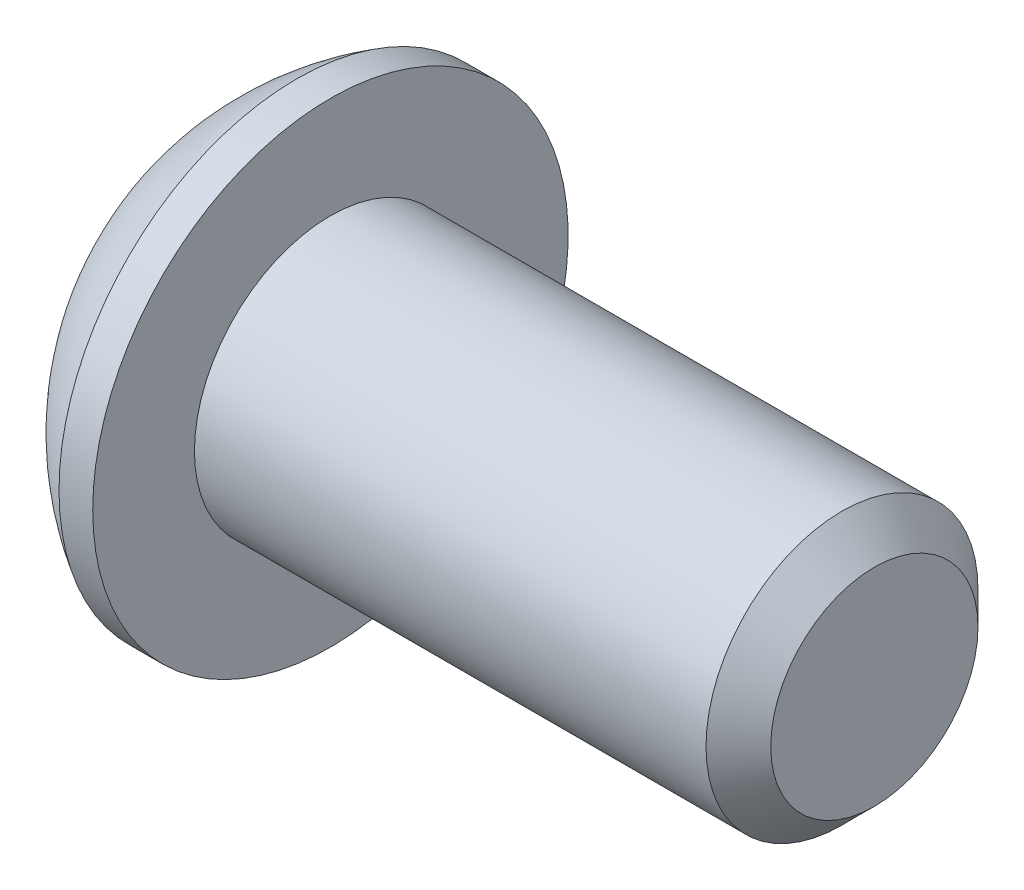
ISO-10303-21;
HEADER;
FILE_DESCRIPTION(('STEP AP214'),'2;1');
FILE_NAME('part.step','',(''),(''),'','','');
FILE_SCHEMA(('AUTOMOTIVE_DESIGN { 1 0 10303 214 1 1 1 1 }'));
ENDSEC;
DATA;
#1=APPLICATION_CONTEXT('core data for automotive mechanical design processes');
#2=APPLICATION_PROTOCOL_DEFINITION('international standard','automotive_design',2000,#1);
#3=PRODUCT_CONTEXT('',#1,'mechanical');
#4=PRODUCT('Part','Part','',(#3));
#5=PRODUCT_RELATED_PRODUCT_CATEGORY('part','',(#4));
#6=PRODUCT_DEFINITION_FORMATION('','',#4);
#7=PRODUCT_DEFINITION_CONTEXT('part definition',#1,'design');
#8=PRODUCT_DEFINITION('design','',#6,#7);
#9=PRODUCT_DEFINITION_SHAPE('','',#8);
#10=(LENGTH_UNIT() NAMED_UNIT(*) SI_UNIT(.MILLI.,.METRE.));
#11=(NAMED_UNIT(*) PLANE_ANGLE_UNIT() SI_UNIT($,.RADIAN.));
#12=(NAMED_UNIT(*) SI_UNIT($,.STERADIAN.) SOLID_ANGLE_UNIT());
#13=UNCERTAINTY_MEASURE_WITH_UNIT(LENGTH_MEASURE(1.E-05),#10,'distance_accuracy_value','');
#14=(GEOMETRIC_REPRESENTATION_CONTEXT(3) GLOBAL_UNCERTAINTY_ASSIGNED_CONTEXT((#13)) GLOBAL_UNIT_ASSIGNED_CONTEXT((#10,
#11,#12)) REPRESENTATION_CONTEXT('',''));
#15=CARTESIAN_POINT('',(0.,0.,0.));
#16=DIRECTION('',(0.,0.,1.));
#17=DIRECTION('',(1.,0.,0.));
#18=AXIS2_PLACEMENT_3D('',#15,#16,#17);
#19=CARTESIAN_POINT('',(0.,0.,0.));
#20=DIRECTION('',(-1.,0.,0.));
#21=DIRECTION('',(0.,0.,1.));
#22=AXIS2_PLACEMENT_3D('',#19,#20,#21);
#23=PLANE('',#22);
#24=CARTESIAN_POINT('',(0.,0.,0.));
#25=DIRECTION('',(-1.,0.,0.));
#26=DIRECTION('',(0.,0.,1.));
#27=AXIS2_PLACEMENT_3D('',#24,#25,#26);
#28=CIRCLE('',#27,2.77495);
#29=CARTESIAN_POINT('',(0.,2.77495,0.));
#30=VERTEX_POINT('',#29);
#31=EDGE_CURVE('E11',#30,#30,#28,.T.);
#32=ORIENTED_EDGE('',*,*,#31,.T.);
#33=EDGE_LOOP('',(#32));
#34=FACE_BOUND('',#33,.T.);
#35=DIRECTION('',(0.,-1.,0.));
#36=VECTOR('',#35,1.);
#37=CARTESIAN_POINT('',(0.,-1.14384635331848,1.9812));
#38=LINE('',#37,#36);
#39=CARTESIAN_POINT('',(0.,1.14384635331849,1.9812));
#40=VERTEX_POINT('',#39);
#41=CARTESIAN_POINT('',(0.,-1.14384635331848,1.9812));
#42=VERTEX_POINT('',#41);
#43=EDGE_CURVE('E50',#40,#42,#38,.T.);
#44=ORIENTED_EDGE('',*,*,#43,.T.);
#45=DIRECTION('',(0.,-0.5,-0.866025403784439));
#46=VECTOR('',#45,1.);
#47=CARTESIAN_POINT('',(0.,-2.28769270663697,0.));
#48=LINE('',#47,#46);
#49=CARTESIAN_POINT('',(0.,-2.28769270663697,0.));
#50=VERTEX_POINT('',#49);
#51=EDGE_CURVE('E374',#42,#50,#48,.T.);
#52=ORIENTED_EDGE('',*,*,#51,.T.);
#53=DIRECTION('',(0.,0.5,-0.866025403784439));
#54=VECTOR('',#53,1.);
#55=CARTESIAN_POINT('',(0.,-1.14384635331848,-1.9812));
#56=LINE('',#55,#54);
#57=CARTESIAN_POINT('',(0.,-1.14384635331848,-1.9812));
#58=VERTEX_POINT('',#57);
#59=EDGE_CURVE('E135',#50,#58,#56,.T.);
#60=ORIENTED_EDGE('',*,*,#59,.T.);
#61=DIRECTION('',(0.,1.,0.));
#62=VECTOR('',#61,1.);
#63=CARTESIAN_POINT('',(0.,1.14384635331849,-1.9812));
#64=LINE('',#63,#62);
#65=CARTESIAN_POINT('',(0.,1.14384635331849,-1.9812));
#66=VERTEX_POINT('',#65);
#67=EDGE_CURVE('E377',#58,#66,#64,.T.);
#68=ORIENTED_EDGE('',*,*,#67,.T.);
#69=DIRECTION('',(0.,0.5,0.866025403784439));
#70=VECTOR('',#69,1.);
#71=CARTESIAN_POINT('',(0.,2.28769270663697,0.));
#72=LINE('',#71,#70);
#73=CARTESIAN_POINT('',(0.,2.28769270663697,0.));
#74=VERTEX_POINT('',#73);
#75=EDGE_CURVE('E379',#66,#74,#72,.T.);
#76=ORIENTED_EDGE('',*,*,#75,.T.);
#77=DIRECTION('',(0.,-0.5,0.866025403784439));
#78=VECTOR('',#77,1.);
#79=CARTESIAN_POINT('',(0.,1.14384635331849,1.9812));
#80=LINE('',#79,#78);
#81=EDGE_CURVE('E381',#74,#40,#80,.T.);
#82=ORIENTED_EDGE('',*,*,#81,.T.);
#83=EDGE_LOOP('',(#44,#52,#60,#68,#76,#82));
#84=FACE_BOUND('',#83,.T.);
#85=ADVANCED_FACE('F36',(#34,#84),#23,.T.);
#86=CARTESIAN_POINT('',(5.78512506188119,0.,0.));
#87=DIRECTION('',(-1.,0.,0.));
#88=DIRECTION('',(0.,1.,0.));
#89=AXIS2_PLACEMENT_3D('',#86,#87,#88);
#90=SPHERICAL_SURFACE('',#89,6.41623094067739);
#91=CARTESIAN_POINT('',(2.5654,0.,0.));
#92=DIRECTION('',(-1.,0.,0.));
#93=DIRECTION('',(0.,0.,1.));
#94=AXIS2_PLACEMENT_3D('',#91,#92,#93);
#95=CIRCLE('',#94,5.5499);
#96=CARTESIAN_POINT('',(2.5654,5.5499,0.));
#97=VERTEX_POINT('',#96);
#98=EDGE_CURVE('E43',#97,#97,#95,.T.);
#99=CARTESIAN_POINT('',(2.5654,5.5499,0.));
#100=CARTESIAN_POINT('',(2.53083708566419,5.52984868712258,0.));
#101=CARTESIAN_POINT('',(2.49646152825914,5.50947442663449,0.));
#102=CARTESIAN_POINT('',(2.42809701945272,5.4680872977392,0.));
#103=CARTESIAN_POINT('',(2.39410806805135,5.44707442933201,0.));
#104=CARTESIAN_POINT('',(2.32652866339446,5.40441737190071,0.));
#105=CARTESIAN_POINT('',(2.29293821013895,5.38277318287661,0.));
#106=CARTESIAN_POINT('',(2.22616751866502,5.33886105159856,0.));
#107=CARTESIAN_POINT('',(2.19298728044662,5.3165931093446,0.));
#108=CARTESIAN_POINT('',(2.12704860244366,5.27144124070729,0.));
#109=CARTESIAN_POINT('',(2.09429016265911,5.24855731432393,0.));
#110=CARTESIAN_POINT('',(2.02920651509859,5.20218146582175,0.));
#111=CARTESIAN_POINT('',(1.99688130732261,5.17868954370292,0.));
#112=CARTESIAN_POINT('',(1.93267540683267,5.13110590319174,0.));
#113=CARTESIAN_POINT('',(1.90079471411871,5.10701418479938,0.));
#114=CARTESIAN_POINT('',(1.83748897146475,5.05823936086599,0.));
#115=CARTESIAN_POINT('',(1.80606392152475,5.03355625532495,0.));
#116=CARTESIAN_POINT('',(1.74368043314138,4.98360727255644,0.));
#117=CARTESIAN_POINT('',(1.71272199469802,4.95834139532897,0.));
#118=CARTESIAN_POINT('',(1.65128253514951,4.90723568808467,0.));
#119=CARTESIAN_POINT('',(1.62080151404435,4.88139585806785,0.));
#120=CARTESIAN_POINT('',(1.56032752837792,4.82915126447053,0.));
#121=CARTESIAN_POINT('',(1.53033456381665,4.80274650089003,0.));
#122=CARTESIAN_POINT('',(1.4708471600897,4.74938125657909,0.));
#123=CARTESIAN_POINT('',(1.44135272092403,4.72242077584864,0.));
#124=CARTESIAN_POINT('',(1.38287266283316,4.6679535076206,0.));
#125=CARTESIAN_POINT('',(1.35388704390797,4.64044672012299,0.));
#126=CARTESIAN_POINT('',(1.29643474354243,4.58489643942842,0.));
#127=CARTESIAN_POINT('',(1.26796806210209,4.55685294623144,0.));
#128=CARTESIAN_POINT('',(1.21156357281885,4.50023904253955,0.));
#129=CARTESIAN_POINT('',(1.18362576497595,4.47166863204464,0.));
#130=CARTESIAN_POINT('',(1.12828877440023,4.41401086607543,0.));
#131=CARTESIAN_POINT('',(1.10088959166741,4.38492351060113,0.));
#132=CARTESIAN_POINT('',(1.04663941482087,4.32624200742802,0.));
#133=CARTESIAN_POINT('',(1.01978842070714,4.2966478597292,0.));
#134=CARTESIAN_POINT('',(0.966643993266067,4.2369631017545,0.));
#135=CARTESIAN_POINT('',(0.940350559938718,4.20687249147862,0.));
#136=CARTESIAN_POINT('',(0.888330431624667,4.14620531128432,0.));
#137=CARTESIAN_POINT('',(0.862603736637965,4.11562874136591,0.));
#138=CARTESIAN_POINT('',(0.811726064743086,4.05400031444217,0.));
#139=CARTESIAN_POINT('',(0.786575087834909,4.02294845743684,0.));
#140=CARTESIAN_POINT('',(0.736857630884289,3.96038029479081,0.));
#141=CARTESIAN_POINT('',(0.712291150841846,3.9288639891501,0.));
#142=CARTESIAN_POINT('',(0.663751262394899,3.8653779297977,0.));
#143=CARTESIAN_POINT('',(0.639777853990395,3.833408176086,0.));
#144=CARTESIAN_POINT('',(0.592432476584127,3.76902637942894,0.));
#145=CARTESIAN_POINT('',(0.569060507582361,3.73661433648358,0.));
#146=CARTESIAN_POINT('',(0.522926166816146,3.67135927457555,0.));
#147=CARTESIAN_POINT('',(0.500163795051695,3.63851625561289,0.));
#148=CARTESIAN_POINT('',(0.455256593824863,3.57241070531295,0.));
#149=CARTESIAN_POINT('',(0.433111764362481,3.53914817397566,0.));
#150=CARTESIAN_POINT('',(0.389447377232278,3.47221520900886,0.));
#151=CARTESIAN_POINT('',(0.367927819564455,3.43854477537934,0.));
#152=CARTESIAN_POINT('',(0.325521487354905,3.37080775824281,0.));
#153=CARTESIAN_POINT('',(0.304634712813177,3.3367411747358,0.));
#154=CARTESIAN_POINT('',(0.263501236996926,3.26822374869429,0.));
#155=CARTESIAN_POINT('',(0.243254535722402,3.23377290615979,0.));
#156=CARTESIAN_POINT('',(0.203408274368181,3.16449898643303,0.));
#157=CARTESIAN_POINT('',(0.183808714288484,3.12967590924076,0.));
#158=CARTESIAN_POINT('',(0.145263572892659,3.05966967674634,0.));
#159=CARTESIAN_POINT('',(0.126317991576532,3.02448652144418,0.));
#160=CARTESIAN_POINT('',(0.0890874337230971,2.95377240655615,0.));
#161=CARTESIAN_POINT('',(0.0708024571857893,2.91824144697028,0.));
#162=CARTESIAN_POINT('',(0.0348994419493865,2.84684415010637,0.));
#163=CARTESIAN_POINT('',(0.0172814032502915,2.81097781282834,0.));
#164=CARTESIAN_POINT('',(0.,2.77495,0.));
#165=B_SPLINE_CURVE_WITH_KNOTS('',3,(#99,#100,#101,#102,#103,#104,#105,#106,#107,#108,#109,#110,
#111,#112,#113,#114,#115,#116,#117,#118,#119,#120,#121,#122,#123,#124,#125,#126,#127,#128,#129,
#130,#131,#132,#133,#134,#135,#136,#137,#138,#139,#140,#141,#142,#143,#144,#145,#146,#147,#148,
#149,#150,#151,#152,#153,#154,#155,#156,#157,#158,#159,#160,#161,#162,#163,#164),.UNSPECIFIED.,
.F.,.F.,(4,2,2,2,2,2,2,2,2,2,2,2,2,2,2,2,2,2,2,2,2,2,2,2,2,2,2,2,2,2,2,2,4),(0.,
0.119872570538485,0.239745141076968,0.359617711615453,0.479490282153937,0.599362852692422,
0.719235423230906,0.83910799376939,0.958980564307874,1.07885313484636,1.19872570538484,
1.31859827592333,1.43847084646181,1.5583434170003,1.67821598753878,1.79808855807726,
1.91796112861575,2.03783369915423,2.15770626969272,2.2775788402312,2.39745141076968,
2.51732398130817,2.63719655184665,2.75706912238514,2.87694169292362,2.99681426346211,
3.11668683400059,3.23655940453907,3.35643197507756,3.47630454561604,3.59617711615453,
3.71604968669301,3.8359222572315),.UNSPECIFIED.);
#166=EDGE_CURVE('BSEAM162',#97,#30,#165,.T.);
#167=ORIENTED_EDGE('',*,*,#98,.T.);
#168=ORIENTED_EDGE('',*,*,#31,.F.);
#169=ORIENTED_EDGE('',*,*,#166,.T.);
#170=ORIENTED_EDGE('',*,*,#166,.F.);
#171=EDGE_LOOP('',(#167,#169,#168,#170));
#172=FACE_BOUND('',#171,.T.);
#173=ADVANCED_FACE('F162',(#172),#90,.T.);
#174=CARTESIAN_POINT('',(0.,0.,0.));
#175=DIRECTION('',(-1.,0.,0.));
#176=DIRECTION('',(0.,0.,1.));
#177=AXIS2_PLACEMENT_3D('',#174,#175,#176);
#178=CYLINDRICAL_SURFACE('',#177,5.5499);
#179=ORIENTED_EDGE('',*,*,#98,.F.);
#180=EDGE_LOOP('',(#179));
#181=FACE_BOUND('',#180,.T.);
#182=CARTESIAN_POINT('',(3.3528,0.,0.));
#183=DIRECTION('',(-1.,0.,0.));
#184=DIRECTION('',(0.,0.,1.));
#185=AXIS2_PLACEMENT_3D('',#182,#183,#184);
#186=CIRCLE('',#185,5.5499);
#187=CARTESIAN_POINT('',(3.3528,0.,5.5499));
#188=VERTEX_POINT('',#187);
#189=EDGE_CURVE('E157',#188,#188,#186,.T.);
#190=ORIENTED_EDGE('',*,*,#189,.T.);
#191=EDGE_LOOP('',(#190));
#192=FACE_BOUND('',#191,.T.);
#193=ADVANCED_FACE('F165',(#181,#192),#178,.T.);
#194=CARTESIAN_POINT('',(3.3528,3.175,0.));
#195=DIRECTION('',(-1.,0.,0.));
#196=DIRECTION('',(0.,0.,1.));
#197=AXIS2_PLACEMENT_3D('',#194,#195,#196);
#198=PLANE('',#197);
#199=ORIENTED_EDGE('',*,*,#189,.F.);
#200=EDGE_LOOP('',(#199));
#201=FACE_BOUND('',#200,.T.);
#202=CARTESIAN_POINT('',(3.3528,0.,0.));
#203=DIRECTION('',(-1.,0.,0.));
#204=DIRECTION('',(0.,0.,1.));
#205=AXIS2_PLACEMENT_3D('',#202,#203,#204);
#206=CIRCLE('',#205,3.175);
#207=CARTESIAN_POINT('',(3.3528,0.,3.175));
#208=VERTEX_POINT('',#207);
#209=EDGE_CURVE('E154',#208,#208,#206,.T.);
#210=ORIENTED_EDGE('',*,*,#209,.T.);
#211=EDGE_LOOP('',(#210));
#212=FACE_BOUND('',#211,.T.);
#213=ADVANCED_FACE('F168',(#201,#212),#198,.F.);
#214=CARTESIAN_POINT('',(0.,0.,0.));
#215=DIRECTION('',(-1.,0.,0.));
#216=DIRECTION('',(0.,0.,1.));
#217=AXIS2_PLACEMENT_3D('',#214,#215,#216);
#218=CYLINDRICAL_SURFACE('',#217,3.175);
#219=ORIENTED_EDGE('',*,*,#209,.F.);
#220=EDGE_LOOP('',(#219));
#221=FACE_BOUND('',#220,.T.);
#222=CARTESIAN_POINT('',(15.29715,0.,0.));
#223=DIRECTION('',(-1.,0.,0.));
#224=DIRECTION('',(0.,0.,1.));
#225=AXIS2_PLACEMENT_3D('',#222,#223,#224);
#226=CIRCLE('',#225,3.175);
#227=CARTESIAN_POINT('',(15.29715,0.,3.175));
#228=VERTEX_POINT('',#227);
#229=EDGE_CURVE('E151',#228,#228,#226,.T.);
#230=ORIENTED_EDGE('',*,*,#229,.T.);
#231=EDGE_LOOP('',(#230));
#232=FACE_BOUND('',#231,.T.);
#233=ADVANCED_FACE('F174',(#221,#232),#218,.T.);
#234=CARTESIAN_POINT('',(16.0528,0.,0.));
#235=DIRECTION('',(-1.,0.,0.));
#236=DIRECTION('',(0.,0.,1.));
#237=AXIS2_PLACEMENT_3D('',#234,#235,#236);
#238=CONICAL_SURFACE('',#237,2.41935,0.785398163397447);
#239=ORIENTED_EDGE('',*,*,#229,.F.);
#240=EDGE_LOOP('',(#239));
#241=FACE_BOUND('',#240,.T.);
#242=CARTESIAN_POINT('',(16.0528,0.,0.));
#243=DIRECTION('',(-1.,0.,0.));
#244=DIRECTION('',(0.,0.,1.));
#245=AXIS2_PLACEMENT_3D('',#242,#243,#244);
#246=CIRCLE('',#245,2.41935);
#247=CARTESIAN_POINT('',(16.0528,0.,2.41935));
#248=VERTEX_POINT('',#247);
#249=EDGE_CURVE('E147',#248,#248,#246,.T.);
#250=ORIENTED_EDGE('',*,*,#249,.T.);
#251=EDGE_LOOP('',(#250));
#252=FACE_BOUND('',#251,.T.);
#253=ADVANCED_FACE('F180',(#241,#252),#238,.T.);
#254=CARTESIAN_POINT('',(16.0528,0.,0.));
#255=DIRECTION('',(-1.,0.,0.));
#256=DIRECTION('',(0.,0.,1.));
#257=AXIS2_PLACEMENT_3D('',#254,#255,#256);
#258=PLANE('',#257);
#259=ORIENTED_EDGE('',*,*,#249,.F.);
#260=EDGE_LOOP('',(#259));
#261=FACE_BOUND('',#260,.T.);
#262=ADVANCED_FACE('F186',(#261),#258,.F.);
#263=CARTESIAN_POINT('',(2.2098,-2.28769270663697,0.));
#264=DIRECTION('',(0.,0.866025403784439,-0.5));
#265=DIRECTION('',(0.,0.5,0.866025403784439));
#266=AXIS2_PLACEMENT_3D('',#263,#264,#265);
#267=PLANE('',#266);
#268=DIRECTION('',(0.,-0.5,-0.866025403784439));
#269=VECTOR('',#268,1.);
#270=CARTESIAN_POINT('',(2.2098,-2.28769270663697,0.));
#271=LINE('',#270,#269);
#272=CARTESIAN_POINT('',(2.2098,-1.14384635331848,1.9812));
#273=VERTEX_POINT('',#272);
#274=CARTESIAN_POINT('',(2.2098,-1.71576952997773,0.990599999999998));
#275=VERTEX_POINT('',#274);
#276=EDGE_CURVE('E118',#273,#275,#271,.T.);
#277=ORIENTED_EDGE('',*,*,#276,.T.);
#278=CARTESIAN_POINT('',(2.2098,-2.28769270663697,0.));
#279=VERTEX_POINT('',#278);
#280=EDGE_CURVE('E111',#275,#279,#271,.T.);
#281=ORIENTED_EDGE('',*,*,#280,.T.);
#282=DIRECTION('',(-1.,0.,0.));
#283=VECTOR('',#282,1.);
#284=CARTESIAN_POINT('',(2.2098,-2.28769270663697,0.));
#285=LINE('',#284,#283);
#286=EDGE_CURVE('E115',#279,#50,#285,.T.);
#287=ORIENTED_EDGE('',*,*,#286,.T.);
#288=ORIENTED_EDGE('',*,*,#51,.F.);
#289=DIRECTION('',(-1.,0.,0.));
#290=VECTOR('',#289,1.);
#291=CARTESIAN_POINT('',(2.2098,-1.14384635331848,1.9812));
#292=LINE('',#291,#290);
#293=EDGE_CURVE('E373',#273,#42,#292,.T.);
#294=ORIENTED_EDGE('',*,*,#293,.F.);
#295=EDGE_LOOP('',(#277,#281,#287,#288,#294));
#296=FACE_BOUND('',#295,.T.);
#297=ADVANCED_FACE('F113',(#296),#267,.T.);
#298=CARTESIAN_POINT('',(2.2098,-1.14384635331848,-1.9812));
#299=DIRECTION('',(0.,0.866025403784439,0.5));
#300=DIRECTION('',(0.,-0.5,0.866025403784439));
#301=AXIS2_PLACEMENT_3D('',#298,#299,#300);
#302=PLANE('',#301);
#303=DIRECTION('',(0.,0.5,-0.866025403784439));
#304=VECTOR('',#303,1.);
#305=CARTESIAN_POINT('',(2.2098,-1.14384635331848,-1.9812));
#306=LINE('',#305,#304);
#307=CARTESIAN_POINT('',(2.2098,-1.71576952997773,-0.990599999999998));
#308=VERTEX_POINT('',#307);
#309=EDGE_CURVE('E123',#279,#308,#306,.T.);
#310=ORIENTED_EDGE('',*,*,#309,.T.);
#311=CARTESIAN_POINT('',(2.2098,-1.14384635331848,-1.9812));
#312=VERTEX_POINT('',#311);
#313=EDGE_CURVE('E130',#308,#312,#306,.T.);
#314=ORIENTED_EDGE('',*,*,#313,.T.);
#315=DIRECTION('',(-1.,0.,0.));
#316=VECTOR('',#315,1.);
#317=CARTESIAN_POINT('',(2.2098,-1.14384635331848,-1.9812));
#318=LINE('',#317,#316);
#319=EDGE_CURVE('E137',#312,#58,#318,.T.);
#320=ORIENTED_EDGE('',*,*,#319,.T.);
#321=ORIENTED_EDGE('',*,*,#59,.F.);
#322=ORIENTED_EDGE('',*,*,#286,.F.);
#323=EDGE_LOOP('',(#310,#314,#320,#321,#322));
#324=FACE_BOUND('',#323,.T.);
#325=ADVANCED_FACE('F133',(#324),#302,.T.);
#326=CARTESIAN_POINT('',(2.2098,1.14384635331849,-1.9812));
#327=DIRECTION('',(0.,0.,1.));
#328=DIRECTION('',(1.,0.,0.));
#329=AXIS2_PLACEMENT_3D('',#326,#327,#328);
#330=PLANE('',#329);
#331=DIRECTION('',(0.,1.,0.));
#332=VECTOR('',#331,1.);
#333=CARTESIAN_POINT('',(2.2098,1.14384635331849,-1.9812));
#334=LINE('',#333,#332);
#335=CARTESIAN_POINT('',(2.2098,0.,-1.9812));
#336=VERTEX_POINT('',#335);
#337=EDGE_CURVE('E398',#312,#336,#334,.T.);
#338=ORIENTED_EDGE('',*,*,#337,.T.);
#339=CARTESIAN_POINT('',(2.2098,1.14384635331849,-1.9812));
#340=VERTEX_POINT('',#339);
#341=EDGE_CURVE('E129',#336,#340,#334,.T.);
#342=ORIENTED_EDGE('',*,*,#341,.T.);
#343=DIRECTION('',(-1.,0.,0.));
#344=VECTOR('',#343,1.);
#345=CARTESIAN_POINT('',(2.2098,1.14384635331849,-1.9812));
#346=LINE('',#345,#344);
#347=EDGE_CURVE('E142',#340,#66,#346,.T.);
#348=ORIENTED_EDGE('',*,*,#347,.T.);
#349=ORIENTED_EDGE('',*,*,#67,.F.);
#350=ORIENTED_EDGE('',*,*,#319,.F.);
#351=EDGE_LOOP('',(#338,#342,#348,#349,#350));
#352=FACE_BOUND('',#351,.T.);
#353=ADVANCED_FACE('F248',(#352),#330,.T.);
#354=CARTESIAN_POINT('',(2.2098,2.28769270663697,0.));
#355=DIRECTION('',(0.,-0.866025403784439,0.5));
#356=DIRECTION('',(0.,-0.5,-0.866025403784439));
#357=AXIS2_PLACEMENT_3D('',#354,#355,#356);
#358=PLANE('',#357);
#359=DIRECTION('',(0.,0.5,0.866025403784439));
#360=VECTOR('',#359,1.);
#361=CARTESIAN_POINT('',(2.2098,2.28769270663697,0.));
#362=LINE('',#361,#360);
#363=CARTESIAN_POINT('',(2.2098,1.71576952997773,-0.9906));
#364=VERTEX_POINT('',#363);
#365=EDGE_CURVE('E360',#340,#364,#362,.T.);
#366=ORIENTED_EDGE('',*,*,#365,.T.);
#367=CARTESIAN_POINT('',(2.2098,2.28769270663697,0.));
#368=VERTEX_POINT('',#367);
#369=EDGE_CURVE('E400',#364,#368,#362,.T.);
#370=ORIENTED_EDGE('',*,*,#369,.T.);
#371=DIRECTION('',(-1.,0.,0.));
#372=VECTOR('',#371,1.);
#373=CARTESIAN_POINT('',(2.2098,2.28769270663697,0.));
#374=LINE('',#373,#372);
#375=EDGE_CURVE('E366',#368,#74,#374,.T.);
#376=ORIENTED_EDGE('',*,*,#375,.T.);
#377=ORIENTED_EDGE('',*,*,#75,.F.);
#378=ORIENTED_EDGE('',*,*,#347,.F.);
#379=EDGE_LOOP('',(#366,#370,#376,#377,#378));
#380=FACE_BOUND('',#379,.T.);
#381=ADVANCED_FACE('F257',(#380),#358,.T.);
#382=CARTESIAN_POINT('',(2.2098,1.14384635331849,1.9812));
#383=DIRECTION('',(0.,-0.866025403784439,-0.5));
#384=DIRECTION('',(0.,0.5,-0.866025403784439));
#385=AXIS2_PLACEMENT_3D('',#382,#383,#384);
#386=PLANE('',#385);
#387=DIRECTION('',(0.,-0.5,0.866025403784439));
#388=VECTOR('',#387,1.);
#389=CARTESIAN_POINT('',(2.2098,1.14384635331849,1.9812));
#390=LINE('',#389,#388);
#391=CARTESIAN_POINT('',(2.2098,1.71576952997773,0.9906));
#392=VERTEX_POINT('',#391);
#393=EDGE_CURVE('E359',#368,#392,#390,.T.);
#394=ORIENTED_EDGE('',*,*,#393,.T.);
#395=CARTESIAN_POINT('',(2.2098,1.14384635331849,1.9812));
#396=VERTEX_POINT('',#395);
#397=EDGE_CURVE('E356',#392,#396,#390,.T.);
#398=ORIENTED_EDGE('',*,*,#397,.T.);
#399=DIRECTION('',(-1.,0.,0.));
#400=VECTOR('',#399,1.);
#401=CARTESIAN_POINT('',(2.2098,1.14384635331849,1.9812));
#402=LINE('',#401,#400);
#403=EDGE_CURVE('E386',#396,#40,#402,.T.);
#404=ORIENTED_EDGE('',*,*,#403,.T.);
#405=ORIENTED_EDGE('',*,*,#81,.F.);
#406=ORIENTED_EDGE('',*,*,#375,.F.);
#407=EDGE_LOOP('',(#394,#398,#404,#405,#406));
#408=FACE_BOUND('',#407,.T.);
#409=ADVANCED_FACE('F267',(#408),#386,.T.);
#410=CARTESIAN_POINT('',(2.2098,-1.14384635331848,1.9812));
#411=DIRECTION('',(0.,0.,-1.));
#412=DIRECTION('',(-1.,0.,0.));
#413=AXIS2_PLACEMENT_3D('',#410,#411,#412);
#414=PLANE('',#413);
#415=DIRECTION('',(0.,-1.,0.));
#416=VECTOR('',#415,1.);
#417=CARTESIAN_POINT('',(2.2098,-1.14384635331848,1.9812));
#418=LINE('',#417,#416);
#419=CARTESIAN_POINT('',(2.2098,0.,1.9812));
#420=VERTEX_POINT('',#419);
#421=EDGE_CURVE('E58',#396,#420,#418,.T.);
#422=ORIENTED_EDGE('',*,*,#421,.T.);
#423=EDGE_CURVE('E368',#420,#273,#418,.T.);
#424=ORIENTED_EDGE('',*,*,#423,.T.);
#425=ORIENTED_EDGE('',*,*,#293,.T.);
#426=ORIENTED_EDGE('',*,*,#43,.F.);
#427=ORIENTED_EDGE('',*,*,#403,.F.);
#428=EDGE_LOOP('',(#422,#424,#425,#426,#427));
#429=FACE_BOUND('',#428,.T.);
#430=ADVANCED_FACE('F277',(#429),#414,.T.);
#431=CARTESIAN_POINT('',(2.2098,-1.14384635331848,1.9812));
#432=DIRECTION('',(-1.,0.,0.));
#433=DIRECTION('',(0.,0.,1.));
#434=AXIS2_PLACEMENT_3D('',#431,#432,#433);
#435=PLANE('',#434);
#436=ORIENTED_EDGE('',*,*,#421,.F.);
#437=ORIENTED_EDGE('',*,*,#397,.F.);
#438=CARTESIAN_POINT('',(2.2098,0.,0.));
#439=DIRECTION('',(-1.,0.,0.));
#440=DIRECTION('',(0.,0.,1.));
#441=AXIS2_PLACEMENT_3D('',#438,#439,#440);
#442=CIRCLE('',#441,1.9812);
#443=EDGE_CURVE('E141',#420,#392,#442,.T.);
#444=ORIENTED_EDGE('',*,*,#443,.F.);
#445=EDGE_LOOP('',(#436,#437,#444));
#446=FACE_BOUND('',#445,.T.);
#447=ADVANCED_FACE('F287',(#446),#435,.T.);
#448=ORIENTED_EDGE('',*,*,#393,.F.);
#449=ORIENTED_EDGE('',*,*,#369,.F.);
#450=EDGE_CURVE('E148',#392,#364,#442,.T.);
#451=ORIENTED_EDGE('',*,*,#450,.F.);
#452=EDGE_LOOP('',(#448,#449,#451));
#453=FACE_BOUND('',#452,.T.);
#454=ADVANCED_FACE('F296',(#453),#435,.T.);
#455=ORIENTED_EDGE('',*,*,#365,.F.);
#456=ORIENTED_EDGE('',*,*,#341,.F.);
#457=EDGE_CURVE('E401',#364,#336,#442,.T.);
#458=ORIENTED_EDGE('',*,*,#457,.F.);
#459=EDGE_LOOP('',(#455,#456,#458));
#460=FACE_BOUND('',#459,.T.);
#461=ADVANCED_FACE('F307',(#460),#435,.T.);
#462=ORIENTED_EDGE('',*,*,#337,.F.);
#463=ORIENTED_EDGE('',*,*,#313,.F.);
#464=EDGE_CURVE('E399',#336,#308,#442,.T.);
#465=ORIENTED_EDGE('',*,*,#464,.F.);
#466=EDGE_LOOP('',(#462,#463,#465));
#467=FACE_BOUND('',#466,.T.);
#468=ADVANCED_FACE('F316',(#467),#435,.T.);
#469=ORIENTED_EDGE('',*,*,#309,.F.);
#470=ORIENTED_EDGE('',*,*,#280,.F.);
#471=EDGE_CURVE('E125',#308,#275,#442,.T.);
#472=ORIENTED_EDGE('',*,*,#471,.F.);
#473=EDGE_LOOP('',(#469,#470,#472));
#474=FACE_BOUND('',#473,.T.);
#475=ADVANCED_FACE('F124',(#474),#435,.T.);
#476=ORIENTED_EDGE('',*,*,#276,.F.);
#477=ORIENTED_EDGE('',*,*,#423,.F.);
#478=EDGE_CURVE('E136',#275,#420,#442,.T.);
#479=ORIENTED_EDGE('',*,*,#478,.F.);
#480=EDGE_LOOP('',(#476,#477,#479));
#481=FACE_BOUND('',#480,.T.);
#482=ADVANCED_FACE('F299',(#481),#435,.T.);
#483=CARTESIAN_POINT('',(3.3536463533185,0.,0.));
#484=DIRECTION('',(-1.,0.,0.));
#485=DIRECTION('',(0.,0.,1.));
#486=AXIS2_PLACEMENT_3D('',#483,#484,#485);
#487=CONICAL_SURFACE('',#486,0.,1.04719755119659);
#488=ORIENTED_EDGE('',*,*,#443,.T.);
#489=ORIENTED_EDGE('',*,*,#450,.T.);
#490=ORIENTED_EDGE('',*,*,#457,.T.);
#491=ORIENTED_EDGE('',*,*,#464,.T.);
#492=ORIENTED_EDGE('',*,*,#471,.T.);
#493=ORIENTED_EDGE('',*,*,#478,.T.);
#494=EDGE_LOOP('',(#488,#489,#490,#491,#492,#493));
#495=FACE_BOUND('',#494,.T.);
#496=CARTESIAN_POINT('',(3.3536463533185,0.,0.));
#497=VERTEX_POINT('',#496);
#498=VERTEX_LOOP('',#497);
#499=FACE_BOUND('',#498,.T.);
#500=ADVANCED_FACE('F340',(#495,#499),#487,.F.);
#501=CLOSED_SHELL('',(#85,#173,#193,#213,#233,#253,#262,#297,#325,#353,#381,#409,#430,#447,#454,
#461,#468,#475,#482,#500));
#502=MANIFOLD_SOLID_BREP('B2',#501);
#503=ADVANCED_BREP_SHAPE_REPRESENTATION('',(#18,#502),#14);
#504=SHAPE_DEFINITION_REPRESENTATION(#9,#503);
ENDSEC;
END-ISO-10303-21;
